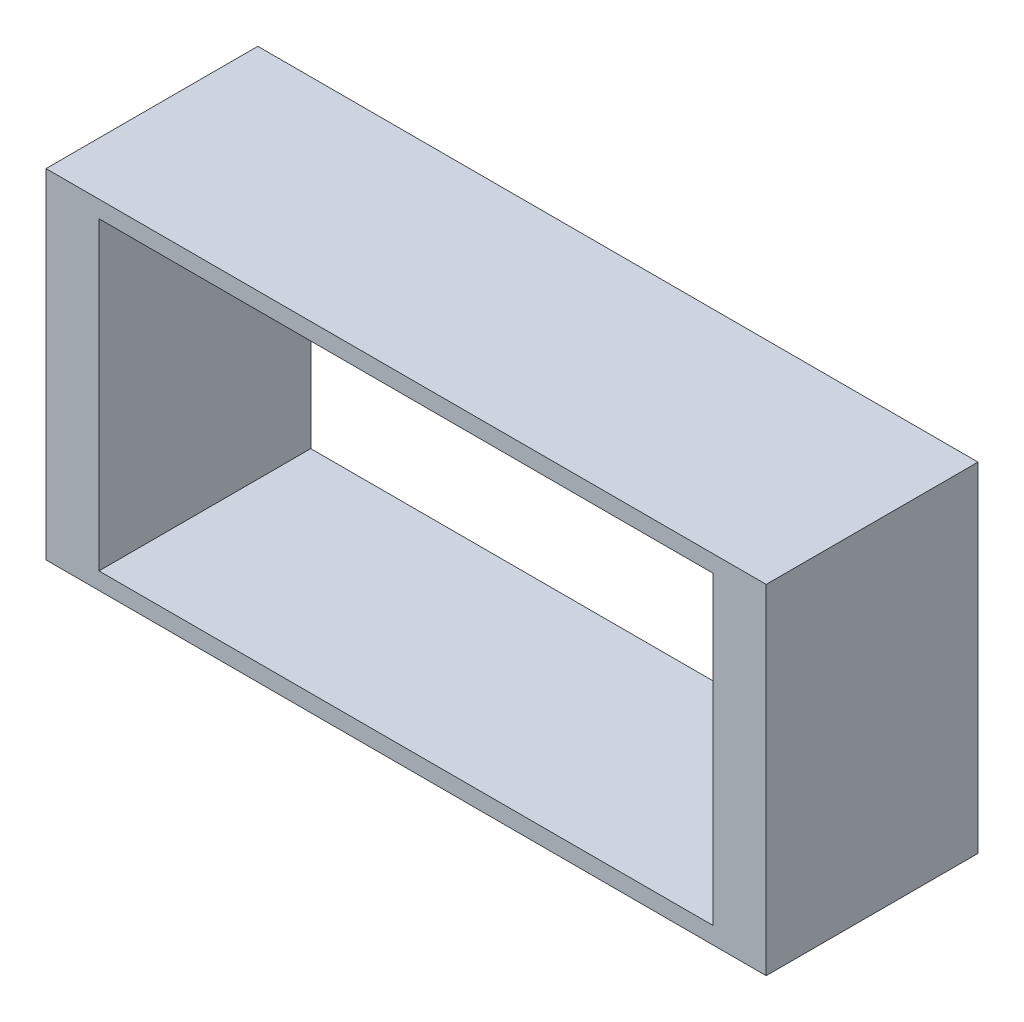
ISO-10303-21;
HEADER;
FILE_DESCRIPTION(('STEP AP214'),'2;1');
FILE_NAME('part.step','',(''),(''),'','','');
FILE_SCHEMA(('AUTOMOTIVE_DESIGN { 1 0 10303 214 1 1 1 1 }'));
ENDSEC;
DATA;
#1=APPLICATION_CONTEXT('core data for automotive mechanical design processes');
#2=APPLICATION_PROTOCOL_DEFINITION('international standard','automotive_design',2000,#1);
#3=PRODUCT_CONTEXT('',#1,'mechanical');
#4=PRODUCT('Part','Part','',(#3));
#5=PRODUCT_RELATED_PRODUCT_CATEGORY('part','',(#4));
#6=PRODUCT_DEFINITION_FORMATION('','',#4);
#7=PRODUCT_DEFINITION_CONTEXT('part definition',#1,'design');
#8=PRODUCT_DEFINITION('design','',#6,#7);
#9=PRODUCT_DEFINITION_SHAPE('','',#8);
#10=(LENGTH_UNIT() NAMED_UNIT(*) SI_UNIT(.MILLI.,.METRE.));
#11=(NAMED_UNIT(*) PLANE_ANGLE_UNIT() SI_UNIT($,.RADIAN.));
#12=(NAMED_UNIT(*) SI_UNIT($,.STERADIAN.) SOLID_ANGLE_UNIT());
#13=UNCERTAINTY_MEASURE_WITH_UNIT(LENGTH_MEASURE(1.E-05),#10,'distance_accuracy_value','');
#14=(GEOMETRIC_REPRESENTATION_CONTEXT(3) GLOBAL_UNCERTAINTY_ASSIGNED_CONTEXT((#13)) GLOBAL_UNIT_ASSIGNED_CONTEXT((#10,
#11,#12)) REPRESENTATION_CONTEXT('',''));
#15=CARTESIAN_POINT('',(0.,0.,0.));
#16=DIRECTION('',(0.,0.,1.));
#17=DIRECTION('',(1.,0.,0.));
#18=AXIS2_PLACEMENT_3D('',#15,#16,#17);
#19=CARTESIAN_POINT('',(0.,0.,10.));
#20=DIRECTION('',(0.,0.,1.));
#21=DIRECTION('',(1.,0.,0.));
#22=AXIS2_PLACEMENT_3D('',#19,#20,#21);
#23=PLANE('',#22);
#24=DIRECTION('',(0.,-1.,0.));
#25=VECTOR('',#24,1.);
#26=CARTESIAN_POINT('',(0.,0.,10.));
#27=LINE('',#26,#25);
#28=CARTESIAN_POINT('',(0.,0.,10.));
#29=VERTEX_POINT('',#28);
#30=CARTESIAN_POINT('',(0.,-16.,10.));
#31=VERTEX_POINT('',#30);
#32=EDGE_CURVE('E157',#29,#31,#27,.T.);
#33=ORIENTED_EDGE('',*,*,#32,.T.);
#34=DIRECTION('',(1.,0.,0.));
#35=VECTOR('',#34,1.);
#36=CARTESIAN_POINT('',(0.,-16.,10.));
#37=LINE('',#36,#35);
#38=CARTESIAN_POINT('',(34.,-16.,10.));
#39=VERTEX_POINT('',#38);
#40=EDGE_CURVE('E162',#31,#39,#37,.T.);
#41=ORIENTED_EDGE('',*,*,#40,.T.);
#42=DIRECTION('',(0.,1.,0.));
#43=VECTOR('',#42,1.);
#44=CARTESIAN_POINT('',(34.,0.,10.));
#45=LINE('',#44,#43);
#46=CARTESIAN_POINT('',(34.,0.,10.));
#47=VERTEX_POINT('',#46);
#48=EDGE_CURVE('E170',#39,#47,#45,.T.);
#49=ORIENTED_EDGE('',*,*,#48,.T.);
#50=DIRECTION('',(-1.,0.,0.));
#51=VECTOR('',#50,1.);
#52=CARTESIAN_POINT('',(0.,0.,10.));
#53=LINE('',#52,#51);
#54=EDGE_CURVE('E168',#47,#29,#53,.T.);
#55=ORIENTED_EDGE('',*,*,#54,.T.);
#56=EDGE_LOOP('',(#33,#41,#49,#55));
#57=FACE_BOUND('',#56,.T.);
#58=DIRECTION('',(1.,0.,0.));
#59=VECTOR('',#58,1.);
#60=CARTESIAN_POINT('',(2.5,-15.2,10.));
#61=LINE('',#60,#59);
#62=CARTESIAN_POINT('',(2.5,-15.2,10.));
#63=VERTEX_POINT('',#62);
#64=CARTESIAN_POINT('',(31.5,-15.2,10.));
#65=VERTEX_POINT('',#64);
#66=EDGE_CURVE('E117',#63,#65,#61,.T.);
#67=ORIENTED_EDGE('',*,*,#66,.F.);
#68=DIRECTION('',(0.,-1.,0.));
#69=VECTOR('',#68,1.);
#70=CARTESIAN_POINT('',(2.5,-0.8,10.));
#71=LINE('',#70,#69);
#72=CARTESIAN_POINT('',(2.5,-0.8,10.));
#73=VERTEX_POINT('',#72);
#74=EDGE_CURVE('E112',#73,#63,#71,.T.);
#75=ORIENTED_EDGE('',*,*,#74,.F.);
#76=DIRECTION('',(-1.,0.,0.));
#77=VECTOR('',#76,1.);
#78=CARTESIAN_POINT('',(2.5,-0.8,10.));
#79=LINE('',#78,#77);
#80=CARTESIAN_POINT('',(31.5,-0.8,10.));
#81=VERTEX_POINT('',#80);
#82=EDGE_CURVE('E140',#81,#73,#79,.T.);
#83=ORIENTED_EDGE('',*,*,#82,.F.);
#84=DIRECTION('',(0.,1.,0.));
#85=VECTOR('',#84,1.);
#86=CARTESIAN_POINT('',(31.5,-0.8,10.));
#87=LINE('',#86,#85);
#88=EDGE_CURVE('E135',#65,#81,#87,.T.);
#89=ORIENTED_EDGE('',*,*,#88,.F.);
#90=EDGE_LOOP('',(#67,#75,#83,#89));
#91=FACE_BOUND('',#90,.T.);
#92=ADVANCED_FACE('F44',(#57,#91),#23,.T.);
#93=CARTESIAN_POINT('',(0.,0.,0.));
#94=DIRECTION('',(0.,0.,1.));
#95=DIRECTION('',(1.,0.,0.));
#96=AXIS2_PLACEMENT_3D('',#93,#94,#95);
#97=PLANE('',#96);
#98=DIRECTION('',(0.,-1.,0.));
#99=VECTOR('',#98,1.);
#100=CARTESIAN_POINT('',(0.,0.,0.));
#101=LINE('',#100,#99);
#102=CARTESIAN_POINT('',(0.,0.,0.));
#103=VERTEX_POINT('',#102);
#104=CARTESIAN_POINT('',(0.,-16.,0.));
#105=VERTEX_POINT('',#104);
#106=EDGE_CURVE('E129',#103,#105,#101,.T.);
#107=ORIENTED_EDGE('',*,*,#106,.F.);
#108=DIRECTION('',(-1.,0.,0.));
#109=VECTOR('',#108,1.);
#110=CARTESIAN_POINT('',(0.,0.,0.));
#111=LINE('',#110,#109);
#112=CARTESIAN_POINT('',(34.,0.,0.));
#113=VERTEX_POINT('',#112);
#114=EDGE_CURVE('E163',#113,#103,#111,.T.);
#115=ORIENTED_EDGE('',*,*,#114,.F.);
#116=DIRECTION('',(0.,1.,0.));
#117=VECTOR('',#116,1.);
#118=CARTESIAN_POINT('',(34.,0.,0.));
#119=LINE('',#118,#117);
#120=CARTESIAN_POINT('',(34.,-16.,0.));
#121=VERTEX_POINT('',#120);
#122=EDGE_CURVE('E177',#121,#113,#119,.T.);
#123=ORIENTED_EDGE('',*,*,#122,.F.);
#124=DIRECTION('',(1.,0.,0.));
#125=VECTOR('',#124,1.);
#126=CARTESIAN_POINT('',(0.,-16.,0.));
#127=LINE('',#126,#125);
#128=EDGE_CURVE('E180',#105,#121,#127,.T.);
#129=ORIENTED_EDGE('',*,*,#128,.F.);
#130=EDGE_LOOP('',(#107,#115,#123,#129));
#131=FACE_BOUND('',#130,.T.);
#132=DIRECTION('',(0.,-1.,0.));
#133=VECTOR('',#132,1.);
#134=CARTESIAN_POINT('',(2.5,-0.8,0.));
#135=LINE('',#134,#133);
#136=CARTESIAN_POINT('',(2.5,-0.8,0.));
#137=VERTEX_POINT('',#136);
#138=CARTESIAN_POINT('',(2.5,-15.2,0.));
#139=VERTEX_POINT('',#138);
#140=EDGE_CURVE('E69',#137,#139,#135,.T.);
#141=ORIENTED_EDGE('',*,*,#140,.T.);
#142=DIRECTION('',(1.,0.,0.));
#143=VECTOR('',#142,1.);
#144=CARTESIAN_POINT('',(2.5,-15.2,0.));
#145=LINE('',#144,#143);
#146=CARTESIAN_POINT('',(31.5,-15.2,0.));
#147=VERTEX_POINT('',#146);
#148=EDGE_CURVE('E130',#139,#147,#145,.T.);
#149=ORIENTED_EDGE('',*,*,#148,.T.);
#150=DIRECTION('',(0.,1.,0.));
#151=VECTOR('',#150,1.);
#152=CARTESIAN_POINT('',(31.5,-0.8,0.));
#153=LINE('',#152,#151);
#154=CARTESIAN_POINT('',(31.5,-0.8,0.));
#155=VERTEX_POINT('',#154);
#156=EDGE_CURVE('E148',#147,#155,#153,.T.);
#157=ORIENTED_EDGE('',*,*,#156,.T.);
#158=DIRECTION('',(-1.,0.,0.));
#159=VECTOR('',#158,1.);
#160=CARTESIAN_POINT('',(2.5,-0.8,0.));
#161=LINE('',#160,#159);
#162=EDGE_CURVE('E123',#155,#137,#161,.T.);
#163=ORIENTED_EDGE('',*,*,#162,.T.);
#164=EDGE_LOOP('',(#141,#149,#157,#163));
#165=FACE_BOUND('',#164,.T.);
#166=ADVANCED_FACE('F201',(#131,#165),#97,.F.);
#167=CARTESIAN_POINT('',(0.,0.,10.));
#168=DIRECTION('',(1.,0.,0.));
#169=DIRECTION('',(0.,1.,0.));
#170=AXIS2_PLACEMENT_3D('',#167,#168,#169);
#171=PLANE('',#170);
#172=ORIENTED_EDGE('',*,*,#106,.T.);
#173=DIRECTION('',(0.,0.,-1.));
#174=VECTOR('',#173,1.);
#175=CARTESIAN_POINT('',(0.,-16.,10.));
#176=LINE('',#175,#174);
#177=EDGE_CURVE('E11',#31,#105,#176,.T.);
#178=ORIENTED_EDGE('',*,*,#177,.F.);
#179=ORIENTED_EDGE('',*,*,#32,.F.);
#180=DIRECTION('',(0.,0.,-1.));
#181=VECTOR('',#180,1.);
#182=CARTESIAN_POINT('',(0.,0.,10.));
#183=LINE('',#182,#181);
#184=EDGE_CURVE('E175',#29,#103,#183,.T.);
#185=ORIENTED_EDGE('',*,*,#184,.T.);
#186=EDGE_LOOP('',(#172,#178,#179,#185));
#187=FACE_BOUND('',#186,.T.);
#188=ADVANCED_FACE('F50',(#187),#171,.F.);
#189=CARTESIAN_POINT('',(0.,-16.,10.));
#190=DIRECTION('',(0.,1.,0.));
#191=DIRECTION('',(0.,0.,1.));
#192=AXIS2_PLACEMENT_3D('',#189,#190,#191);
#193=PLANE('',#192);
#194=ORIENTED_EDGE('',*,*,#128,.T.);
#195=DIRECTION('',(0.,0.,-1.));
#196=VECTOR('',#195,1.);
#197=CARTESIAN_POINT('',(34.,-16.,10.));
#198=LINE('',#197,#196);
#199=EDGE_CURVE('E53',#39,#121,#198,.T.);
#200=ORIENTED_EDGE('',*,*,#199,.F.);
#201=ORIENTED_EDGE('',*,*,#40,.F.);
#202=ORIENTED_EDGE('',*,*,#177,.T.);
#203=EDGE_LOOP('',(#194,#200,#201,#202));
#204=FACE_BOUND('',#203,.T.);
#205=ADVANCED_FACE('F213',(#204),#193,.F.);
#206=CARTESIAN_POINT('',(34.,0.,10.));
#207=DIRECTION('',(-1.,0.,0.));
#208=DIRECTION('',(0.,0.,1.));
#209=AXIS2_PLACEMENT_3D('',#206,#207,#208);
#210=PLANE('',#209);
#211=ORIENTED_EDGE('',*,*,#122,.T.);
#212=DIRECTION('',(0.,0.,-1.));
#213=VECTOR('',#212,1.);
#214=CARTESIAN_POINT('',(34.,0.,10.));
#215=LINE('',#214,#213);
#216=EDGE_CURVE('E190',#47,#113,#215,.T.);
#217=ORIENTED_EDGE('',*,*,#216,.F.);
#218=ORIENTED_EDGE('',*,*,#48,.F.);
#219=ORIENTED_EDGE('',*,*,#199,.T.);
#220=EDGE_LOOP('',(#211,#217,#218,#219));
#221=FACE_BOUND('',#220,.T.);
#222=ADVANCED_FACE('F197',(#221),#210,.F.);
#223=CARTESIAN_POINT('',(0.,0.,10.));
#224=DIRECTION('',(0.,-1.,0.));
#225=DIRECTION('',(0.,0.,-1.));
#226=AXIS2_PLACEMENT_3D('',#223,#224,#225);
#227=PLANE('',#226);
#228=ORIENTED_EDGE('',*,*,#114,.T.);
#229=ORIENTED_EDGE('',*,*,#184,.F.);
#230=ORIENTED_EDGE('',*,*,#54,.F.);
#231=ORIENTED_EDGE('',*,*,#216,.T.);
#232=EDGE_LOOP('',(#228,#229,#230,#231));
#233=FACE_BOUND('',#232,.T.);
#234=ADVANCED_FACE('F210',(#233),#227,.F.);
#235=CARTESIAN_POINT('',(2.5,-0.8,10.));
#236=DIRECTION('',(1.,0.,0.));
#237=DIRECTION('',(0.,1.,0.));
#238=AXIS2_PLACEMENT_3D('',#235,#236,#237);
#239=PLANE('',#238);
#240=ORIENTED_EDGE('',*,*,#140,.F.);
#241=DIRECTION('',(0.,0.,-1.));
#242=VECTOR('',#241,1.);
#243=CARTESIAN_POINT('',(2.5,-0.8,10.));
#244=LINE('',#243,#242);
#245=EDGE_CURVE('E113',#73,#137,#244,.T.);
#246=ORIENTED_EDGE('',*,*,#245,.F.);
#247=ORIENTED_EDGE('',*,*,#74,.T.);
#248=DIRECTION('',(0.,0.,-1.));
#249=VECTOR('',#248,1.);
#250=CARTESIAN_POINT('',(2.5,-15.2,10.));
#251=LINE('',#250,#249);
#252=EDGE_CURVE('E111',#63,#139,#251,.T.);
#253=ORIENTED_EDGE('',*,*,#252,.T.);
#254=EDGE_LOOP('',(#240,#246,#247,#253));
#255=FACE_BOUND('',#254,.T.);
#256=ADVANCED_FACE('F114',(#255),#239,.T.);
#257=CARTESIAN_POINT('',(2.5,-15.2,10.));
#258=DIRECTION('',(0.,1.,0.));
#259=DIRECTION('',(0.,0.,1.));
#260=AXIS2_PLACEMENT_3D('',#257,#258,#259);
#261=PLANE('',#260);
#262=ORIENTED_EDGE('',*,*,#148,.F.);
#263=ORIENTED_EDGE('',*,*,#252,.F.);
#264=ORIENTED_EDGE('',*,*,#66,.T.);
#265=DIRECTION('',(0.,0.,-1.));
#266=VECTOR('',#265,1.);
#267=CARTESIAN_POINT('',(31.5,-15.2,10.));
#268=LINE('',#267,#266);
#269=EDGE_CURVE('E128',#65,#147,#268,.T.);
#270=ORIENTED_EDGE('',*,*,#269,.T.);
#271=EDGE_LOOP('',(#262,#263,#264,#270));
#272=FACE_BOUND('',#271,.T.);
#273=ADVANCED_FACE('F124',(#272),#261,.T.);
#274=CARTESIAN_POINT('',(31.5,-0.8,10.));
#275=DIRECTION('',(-1.,0.,0.));
#276=DIRECTION('',(0.,0.,1.));
#277=AXIS2_PLACEMENT_3D('',#274,#275,#276);
#278=PLANE('',#277);
#279=ORIENTED_EDGE('',*,*,#156,.F.);
#280=ORIENTED_EDGE('',*,*,#269,.F.);
#281=ORIENTED_EDGE('',*,*,#88,.T.);
#282=DIRECTION('',(0.,0.,-1.));
#283=VECTOR('',#282,1.);
#284=CARTESIAN_POINT('',(31.5,-0.8,10.));
#285=LINE('',#284,#283);
#286=EDGE_CURVE('E64',#81,#155,#285,.T.);
#287=ORIENTED_EDGE('',*,*,#286,.T.);
#288=EDGE_LOOP('',(#279,#280,#281,#287));
#289=FACE_BOUND('',#288,.T.);
#290=ADVANCED_FACE('F237',(#289),#278,.T.);
#291=CARTESIAN_POINT('',(2.5,-0.8,10.));
#292=DIRECTION('',(0.,-1.,0.));
#293=DIRECTION('',(1.,0.,0.));
#294=AXIS2_PLACEMENT_3D('',#291,#292,#293);
#295=PLANE('',#294);
#296=ORIENTED_EDGE('',*,*,#162,.F.);
#297=ORIENTED_EDGE('',*,*,#286,.F.);
#298=ORIENTED_EDGE('',*,*,#82,.T.);
#299=ORIENTED_EDGE('',*,*,#245,.T.);
#300=EDGE_LOOP('',(#296,#297,#298,#299));
#301=FACE_BOUND('',#300,.T.);
#302=ADVANCED_FACE('F238',(#301),#295,.T.);
#303=CLOSED_SHELL('',(#92,#166,#188,#205,#222,#234,#256,#273,#290,#302));
#304=MANIFOLD_SOLID_BREP('B2',#303);
#305=ADVANCED_BREP_SHAPE_REPRESENTATION('',(#18,#304),#14);
#306=SHAPE_DEFINITION_REPRESENTATION(#9,#305);
ENDSEC;
END-ISO-10303-21;
